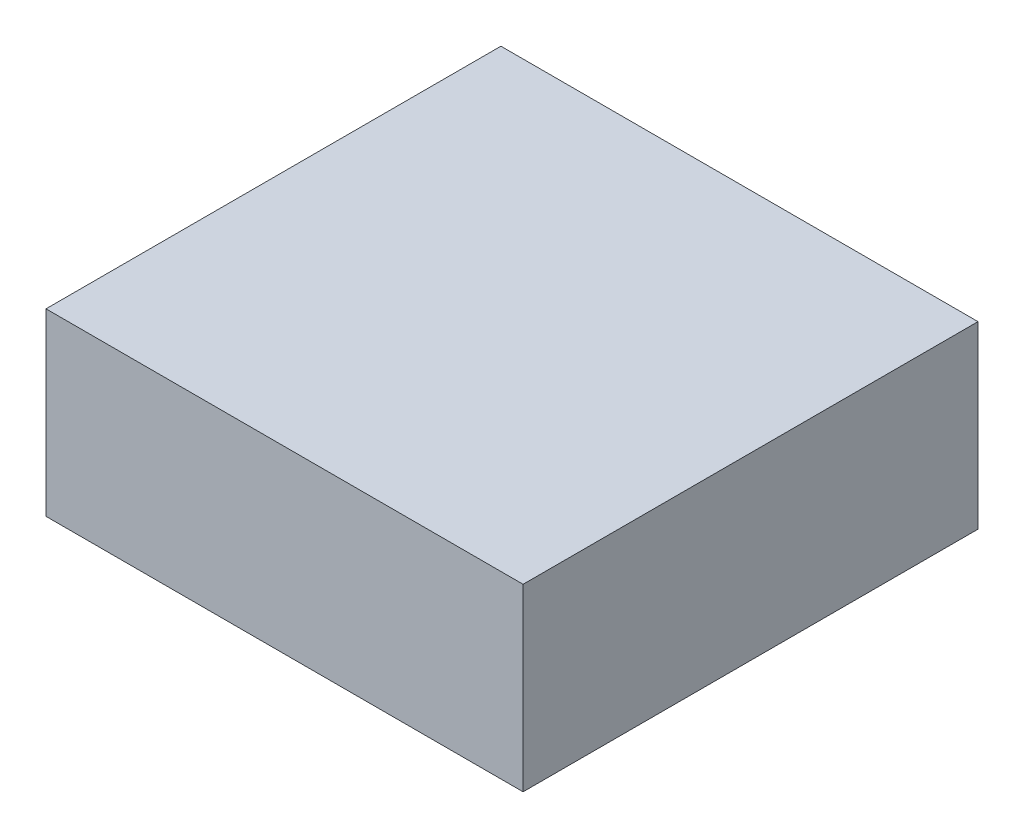
ISO-10303-21;
HEADER;
FILE_DESCRIPTION(('STEP AP214'),'2;1');
FILE_NAME('part.step','',(''),(''),'','','');
FILE_SCHEMA(('AUTOMOTIVE_DESIGN { 1 0 10303 214 1 1 1 1 }'));
ENDSEC;
DATA;
#1=APPLICATION_CONTEXT('core data for automotive mechanical design processes');
#2=APPLICATION_PROTOCOL_DEFINITION('international standard','automotive_design',2000,#1);
#3=PRODUCT_CONTEXT('',#1,'mechanical');
#4=PRODUCT('Part','Part','',(#3));
#5=PRODUCT_RELATED_PRODUCT_CATEGORY('part','',(#4));
#6=PRODUCT_DEFINITION_FORMATION('','',#4);
#7=PRODUCT_DEFINITION_CONTEXT('part definition',#1,'design');
#8=PRODUCT_DEFINITION('design','',#6,#7);
#9=PRODUCT_DEFINITION_SHAPE('','',#8);
#10=(LENGTH_UNIT() NAMED_UNIT(*) SI_UNIT(.MILLI.,.METRE.));
#11=(NAMED_UNIT(*) PLANE_ANGLE_UNIT() SI_UNIT($,.RADIAN.));
#12=(NAMED_UNIT(*) SI_UNIT($,.STERADIAN.) SOLID_ANGLE_UNIT());
#13=UNCERTAINTY_MEASURE_WITH_UNIT(LENGTH_MEASURE(1.E-05),#10,'distance_accuracy_value','');
#14=(GEOMETRIC_REPRESENTATION_CONTEXT(3) GLOBAL_UNCERTAINTY_ASSIGNED_CONTEXT((#13)) GLOBAL_UNIT_ASSIGNED_CONTEXT((#10,
#11,#12)) REPRESENTATION_CONTEXT('',''));
#15=CARTESIAN_POINT('',(0.,0.,0.));
#16=DIRECTION('',(0.,0.,1.));
#17=DIRECTION('',(1.,0.,0.));
#18=AXIS2_PLACEMENT_3D('',#15,#16,#17);
#19=CARTESIAN_POINT('',(215.,162.,205.));
#20=DIRECTION('',(-1.,0.,0.));
#21=DIRECTION('',(0.,0.,1.));
#22=AXIS2_PLACEMENT_3D('',#19,#20,#21);
#23=PLANE('',#22);
#24=DIRECTION('',(0.,0.,-1.));
#25=VECTOR('',#24,1.);
#26=CARTESIAN_POINT('',(215.,0.,205.));
#27=LINE('',#26,#25);
#28=CARTESIAN_POINT('',(215.,0.,205.));
#29=VERTEX_POINT('',#28);
#30=CARTESIAN_POINT('',(215.,0.,-205.));
#31=VERTEX_POINT('',#30);
#32=EDGE_CURVE('E97',#29,#31,#27,.T.);
#33=ORIENTED_EDGE('',*,*,#32,.T.);
#34=DIRECTION('',(0.,-1.,0.));
#35=VECTOR('',#34,1.);
#36=CARTESIAN_POINT('',(215.,162.,-205.));
#37=LINE('',#36,#35);
#38=CARTESIAN_POINT('',(215.,162.,-205.));
#39=VERTEX_POINT('',#38);
#40=EDGE_CURVE('E11',#39,#31,#37,.T.);
#41=ORIENTED_EDGE('',*,*,#40,.F.);
#42=DIRECTION('',(0.,0.,-1.));
#43=VECTOR('',#42,1.);
#44=CARTESIAN_POINT('',(215.,162.,205.));
#45=LINE('',#44,#43);
#46=CARTESIAN_POINT('',(215.,162.,205.));
#47=VERTEX_POINT('',#46);
#48=EDGE_CURVE('E85',#47,#39,#45,.T.);
#49=ORIENTED_EDGE('',*,*,#48,.F.);
#50=DIRECTION('',(0.,-1.,0.));
#51=VECTOR('',#50,1.);
#52=CARTESIAN_POINT('',(215.,162.,205.));
#53=LINE('',#52,#51);
#54=EDGE_CURVE('E93',#47,#29,#53,.T.);
#55=ORIENTED_EDGE('',*,*,#54,.T.);
#56=EDGE_LOOP('',(#33,#41,#49,#55));
#57=FACE_BOUND('',#56,.T.);
#58=ADVANCED_FACE('F34',(#57),#23,.F.);
#59=CARTESIAN_POINT('',(-215.,162.,-205.));
#60=DIRECTION('',(0.,0.,1.));
#61=DIRECTION('',(1.,0.,0.));
#62=AXIS2_PLACEMENT_3D('',#59,#60,#61);
#63=PLANE('',#62);
#64=DIRECTION('',(-1.,0.,0.));
#65=VECTOR('',#64,1.);
#66=CARTESIAN_POINT('',(-215.,0.,-205.));
#67=LINE('',#66,#65);
#68=CARTESIAN_POINT('',(-215.,0.,-205.));
#69=VERTEX_POINT('',#68);
#70=EDGE_CURVE('E89',#31,#69,#67,.T.);
#71=ORIENTED_EDGE('',*,*,#70,.T.);
#72=DIRECTION('',(0.,-1.,0.));
#73=VECTOR('',#72,1.);
#74=CARTESIAN_POINT('',(-215.,162.,-205.));
#75=LINE('',#74,#73);
#76=CARTESIAN_POINT('',(-215.,162.,-205.));
#77=VERTEX_POINT('',#76);
#78=EDGE_CURVE('E42',#77,#69,#75,.T.);
#79=ORIENTED_EDGE('',*,*,#78,.F.);
#80=DIRECTION('',(-1.,0.,0.));
#81=VECTOR('',#80,1.);
#82=CARTESIAN_POINT('',(-215.,162.,-205.));
#83=LINE('',#82,#81);
#84=EDGE_CURVE('E80',#39,#77,#83,.T.);
#85=ORIENTED_EDGE('',*,*,#84,.F.);
#86=ORIENTED_EDGE('',*,*,#40,.T.);
#87=EDGE_LOOP('',(#71,#79,#85,#86));
#88=FACE_BOUND('',#87,.T.);
#89=ADVANCED_FACE('F88',(#88),#63,.F.);
#90=CARTESIAN_POINT('',(-215.,162.,205.));
#91=DIRECTION('',(1.,0.,0.));
#92=DIRECTION('',(0.,0.,-1.));
#93=AXIS2_PLACEMENT_3D('',#90,#91,#92);
#94=PLANE('',#93);
#95=DIRECTION('',(0.,0.,1.));
#96=VECTOR('',#95,1.);
#97=CARTESIAN_POINT('',(-215.,0.,205.));
#98=LINE('',#97,#96);
#99=CARTESIAN_POINT('',(-215.,0.,205.));
#100=VERTEX_POINT('',#99);
#101=EDGE_CURVE('E67',#69,#100,#98,.T.);
#102=ORIENTED_EDGE('',*,*,#101,.T.);
#103=DIRECTION('',(0.,-1.,0.));
#104=VECTOR('',#103,1.);
#105=CARTESIAN_POINT('',(-215.,162.,205.));
#106=LINE('',#105,#104);
#107=CARTESIAN_POINT('',(-215.,162.,205.));
#108=VERTEX_POINT('',#107);
#109=EDGE_CURVE('E90',#108,#100,#106,.T.);
#110=ORIENTED_EDGE('',*,*,#109,.F.);
#111=DIRECTION('',(0.,0.,1.));
#112=VECTOR('',#111,1.);
#113=CARTESIAN_POINT('',(-215.,162.,205.));
#114=LINE('',#113,#112);
#115=EDGE_CURVE('E83',#77,#108,#114,.T.);
#116=ORIENTED_EDGE('',*,*,#115,.F.);
#117=ORIENTED_EDGE('',*,*,#78,.T.);
#118=EDGE_LOOP('',(#102,#110,#116,#117));
#119=FACE_BOUND('',#118,.T.);
#120=ADVANCED_FACE('F91',(#119),#94,.F.);
#121=CARTESIAN_POINT('',(-215.,162.,205.));
#122=DIRECTION('',(0.,0.,-1.));
#123=DIRECTION('',(-1.,0.,0.));
#124=AXIS2_PLACEMENT_3D('',#121,#122,#123);
#125=PLANE('',#124);
#126=DIRECTION('',(1.,0.,0.));
#127=VECTOR('',#126,1.);
#128=CARTESIAN_POINT('',(-215.,0.,205.));
#129=LINE('',#128,#127);
#130=EDGE_CURVE('E73',#100,#29,#129,.T.);
#131=ORIENTED_EDGE('',*,*,#130,.T.);
#132=ORIENTED_EDGE('',*,*,#54,.F.);
#133=DIRECTION('',(1.,0.,0.));
#134=VECTOR('',#133,1.);
#135=CARTESIAN_POINT('',(-215.,162.,205.));
#136=LINE('',#135,#134);
#137=EDGE_CURVE('E50',#108,#47,#136,.T.);
#138=ORIENTED_EDGE('',*,*,#137,.F.);
#139=ORIENTED_EDGE('',*,*,#109,.T.);
#140=EDGE_LOOP('',(#131,#132,#138,#139));
#141=FACE_BOUND('',#140,.T.);
#142=ADVANCED_FACE('F104',(#141),#125,.F.);
#143=CARTESIAN_POINT('',(0.,162.,0.));
#144=DIRECTION('',(0.,-1.,0.));
#145=DIRECTION('',(0.,0.,-1.));
#146=AXIS2_PLACEMENT_3D('',#143,#144,#145);
#147=PLANE('',#146);
#148=ORIENTED_EDGE('',*,*,#48,.T.);
#149=ORIENTED_EDGE('',*,*,#84,.T.);
#150=ORIENTED_EDGE('',*,*,#115,.T.);
#151=ORIENTED_EDGE('',*,*,#137,.T.);
#152=EDGE_LOOP('',(#148,#149,#150,#151));
#153=FACE_BOUND('',#152,.T.);
#154=ADVANCED_FACE('F81',(#153),#147,.F.);
#155=CARTESIAN_POINT('',(0.,0.,0.));
#156=DIRECTION('',(0.,-1.,0.));
#157=DIRECTION('',(0.,0.,-1.));
#158=AXIS2_PLACEMENT_3D('',#155,#156,#157);
#159=PLANE('',#158);
#160=ORIENTED_EDGE('',*,*,#32,.F.);
#161=ORIENTED_EDGE('',*,*,#130,.F.);
#162=ORIENTED_EDGE('',*,*,#101,.F.);
#163=ORIENTED_EDGE('',*,*,#70,.F.);
#164=EDGE_LOOP('',(#160,#161,#162,#163));
#165=FACE_BOUND('',#164,.T.);
#166=ADVANCED_FACE('F107',(#165),#159,.T.);
#167=CLOSED_SHELL('',(#58,#89,#120,#142,#154,#166));
#168=MANIFOLD_SOLID_BREP('B2',#167);
#169=ADVANCED_BREP_SHAPE_REPRESENTATION('',(#18,#168),#14);
#170=SHAPE_DEFINITION_REPRESENTATION(#9,#169);
ENDSEC;
END-ISO-10303-21;
